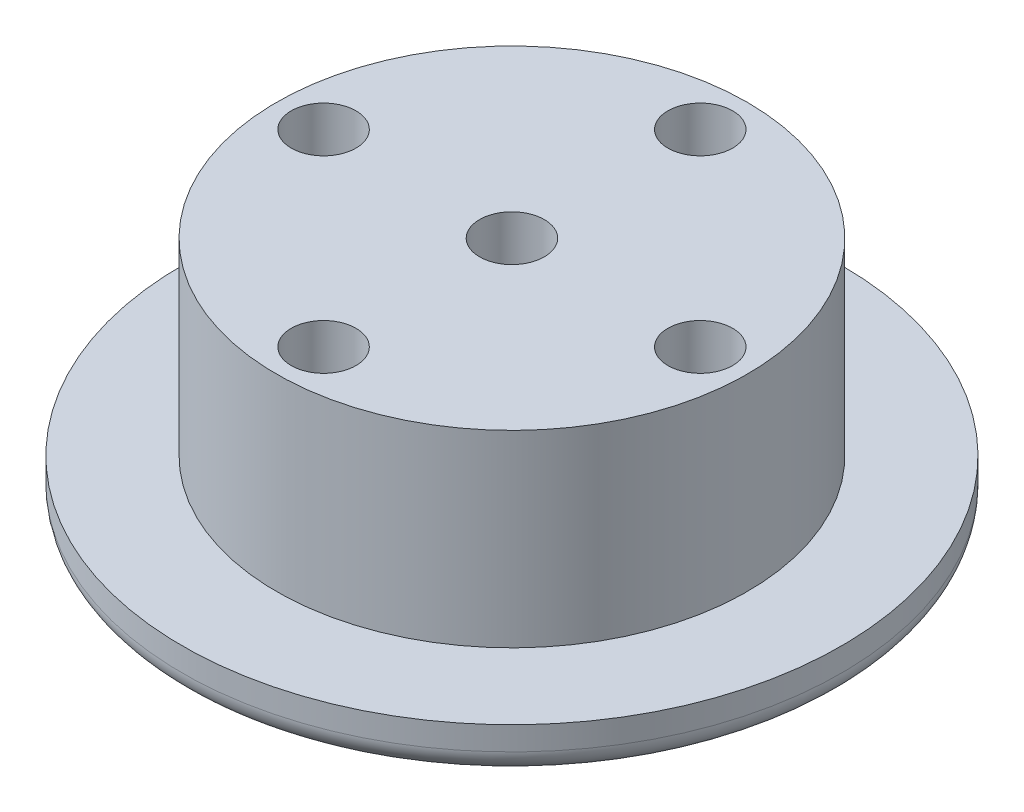
ISO-10303-21;
HEADER;
FILE_DESCRIPTION(('STEP AP214'),'2;1');
FILE_NAME('part.step','',(''),(''),'','','');
FILE_SCHEMA(('AUTOMOTIVE_DESIGN { 1 0 10303 214 1 1 1 1 }'));
ENDSEC;
DATA;
#1=APPLICATION_CONTEXT('core data for automotive mechanical design processes');
#2=APPLICATION_PROTOCOL_DEFINITION('international standard','automotive_design',2000,#1);
#3=PRODUCT_CONTEXT('',#1,'mechanical');
#4=PRODUCT('Part','Part','',(#3));
#5=PRODUCT_RELATED_PRODUCT_CATEGORY('part','',(#4));
#6=PRODUCT_DEFINITION_FORMATION('','',#4);
#7=PRODUCT_DEFINITION_CONTEXT('part definition',#1,'design');
#8=PRODUCT_DEFINITION('design','',#6,#7);
#9=PRODUCT_DEFINITION_SHAPE('','',#8);
#10=(LENGTH_UNIT() NAMED_UNIT(*) SI_UNIT(.MILLI.,.METRE.));
#11=(NAMED_UNIT(*) PLANE_ANGLE_UNIT() SI_UNIT($,.RADIAN.));
#12=(NAMED_UNIT(*) SI_UNIT($,.STERADIAN.) SOLID_ANGLE_UNIT());
#13=UNCERTAINTY_MEASURE_WITH_UNIT(LENGTH_MEASURE(1.E-05),#10,'distance_accuracy_value','');
#14=(GEOMETRIC_REPRESENTATION_CONTEXT(3) GLOBAL_UNCERTAINTY_ASSIGNED_CONTEXT((#13)) GLOBAL_UNIT_ASSIGNED_CONTEXT((#10,
#11,#12)) REPRESENTATION_CONTEXT('',''));
#15=CARTESIAN_POINT('',(0.,0.,0.));
#16=DIRECTION('',(0.,0.,1.));
#17=DIRECTION('',(1.,0.,0.));
#18=AXIS2_PLACEMENT_3D('',#15,#16,#17);
#19=CARTESIAN_POINT('',(20.6375,0.,0.));
#20=DIRECTION('',(0.,-1.,0.));
#21=DIRECTION('',(0.,0.,-1.));
#22=AXIS2_PLACEMENT_3D('',#19,#20,#21);
#23=PLANE('',#22);
#24=CARTESIAN_POINT('',(12.7,0.,0.));
#25=DIRECTION('',(0.,1.,0.));
#26=DIRECTION('',(0.,0.,1.));
#27=AXIS2_PLACEMENT_3D('',#24,#25,#26);
#28=CIRCLE('',#27,2.1828125);
#29=CARTESIAN_POINT('',(12.7,0.,2.1828125));
#30=VERTEX_POINT('',#29);
#31=EDGE_CURVE('E117',#30,#30,#28,.T.);
#32=ORIENTED_EDGE('',*,*,#31,.T.);
#33=EDGE_LOOP('',(#32));
#34=FACE_BOUND('',#33,.T.);
#35=CARTESIAN_POINT('',(-12.7,0.,0.));
#36=DIRECTION('',(0.,1.,0.));
#37=DIRECTION('',(0.,0.,1.));
#38=AXIS2_PLACEMENT_3D('',#35,#36,#37);
#39=CIRCLE('',#38,2.1828125);
#40=CARTESIAN_POINT('',(-12.7,0.,2.1828125));
#41=VERTEX_POINT('',#40);
#42=EDGE_CURVE('E121',#41,#41,#39,.T.);
#43=ORIENTED_EDGE('',*,*,#42,.T.);
#44=EDGE_LOOP('',(#43));
#45=FACE_BOUND('',#44,.T.);
#46=CARTESIAN_POINT('',(0.,0.,12.7));
#47=DIRECTION('',(0.,1.,0.));
#48=DIRECTION('',(0.,0.,1.));
#49=AXIS2_PLACEMENT_3D('',#46,#47,#48);
#50=CIRCLE('',#49,2.1828125);
#51=CARTESIAN_POINT('',(0.,0.,14.8828125));
#52=VERTEX_POINT('',#51);
#53=EDGE_CURVE('E125',#52,#52,#50,.T.);
#54=ORIENTED_EDGE('',*,*,#53,.T.);
#55=EDGE_LOOP('',(#54));
#56=FACE_BOUND('',#55,.T.);
#57=CARTESIAN_POINT('',(0.,0.,-12.7));
#58=DIRECTION('',(0.,1.,0.));
#59=DIRECTION('',(0.,0.,1.));
#60=AXIS2_PLACEMENT_3D('',#57,#58,#59);
#61=CIRCLE('',#60,2.1828125);
#62=CARTESIAN_POINT('',(0.,0.,-10.5171875));
#63=VERTEX_POINT('',#62);
#64=EDGE_CURVE('E129',#63,#63,#61,.T.);
#65=ORIENTED_EDGE('',*,*,#64,.T.);
#66=EDGE_LOOP('',(#65));
#67=FACE_BOUND('',#66,.T.);
#68=CARTESIAN_POINT('',(0.,0.,0.));
#69=DIRECTION('',(0.,1.,0.));
#70=DIRECTION('',(0.,0.,1.));
#71=AXIS2_PLACEMENT_3D('',#68,#69,#70);
#72=CIRCLE('',#71,2.1828125);
#73=CARTESIAN_POINT('',(0.,0.,2.1828125));
#74=VERTEX_POINT('',#73);
#75=EDGE_CURVE('E60',#74,#74,#72,.T.);
#76=ORIENTED_EDGE('',*,*,#75,.T.);
#77=EDGE_LOOP('',(#76));
#78=FACE_BOUND('',#77,.T.);
#79=CARTESIAN_POINT('',(0.,0.,0.));
#80=DIRECTION('',(0.,-1.,0.));
#81=DIRECTION('',(0.,0.,-1.));
#82=AXIS2_PLACEMENT_3D('',#79,#80,#81);
#83=CIRCLE('',#82,20.6375);
#84=CARTESIAN_POINT('',(0.,0.,-20.6375));
#85=VERTEX_POINT('',#84);
#86=EDGE_CURVE('E10',#85,#85,#83,.T.);
#87=ORIENTED_EDGE('',*,*,#86,.T.);
#88=EDGE_LOOP('',(#87));
#89=FACE_BOUND('',#88,.T.);
#90=ADVANCED_FACE('F37',(#34,#45,#56,#67,#78,#89),#23,.T.);
#91=CARTESIAN_POINT('',(0.,1.5875,0.));
#92=DIRECTION('',(0.,-1.,0.));
#93=DIRECTION('',(0.,0.,-1.));
#94=AXIS2_PLACEMENT_3D('',#91,#92,#93);
#95=TOROIDAL_SURFACE('',#94,20.6375,1.5875);
#96=CARTESIAN_POINT('',(0.,1.58750000000001,0.));
#97=DIRECTION('',(0.,-1.,0.));
#98=DIRECTION('',(0.,0.,-1.));
#99=AXIS2_PLACEMENT_3D('',#96,#97,#98);
#100=CIRCLE('',#99,22.225);
#101=CARTESIAN_POINT('',(0.,1.58750000000001,-22.225));
#102=VERTEX_POINT('',#101);
#103=EDGE_CURVE('E45',#102,#102,#100,.T.);
#104=ORIENTED_EDGE('',*,*,#103,.T.);
#105=EDGE_LOOP('',(#104));
#106=FACE_BOUND('',#105,.T.);
#107=ORIENTED_EDGE('',*,*,#86,.F.);
#108=EDGE_LOOP('',(#107));
#109=FACE_BOUND('',#108,.T.);
#110=ADVANCED_FACE('F106',(#106,#109),#95,.T.);
#111=CARTESIAN_POINT('',(0.,0.,0.));
#112=DIRECTION('',(0.,-1.,0.));
#113=DIRECTION('',(0.,0.,-1.));
#114=AXIS2_PLACEMENT_3D('',#111,#112,#113);
#115=CYLINDRICAL_SURFACE('',#114,22.225);
#116=CARTESIAN_POINT('',(0.,3.175,0.));
#117=DIRECTION('',(0.,-1.,0.));
#118=DIRECTION('',(0.,0.,-1.));
#119=AXIS2_PLACEMENT_3D('',#116,#117,#118);
#120=CIRCLE('',#119,22.225);
#121=CARTESIAN_POINT('',(0.,3.175,-22.225));
#122=VERTEX_POINT('',#121);
#123=EDGE_CURVE('E51',#122,#122,#120,.T.);
#124=ORIENTED_EDGE('',*,*,#123,.T.);
#125=EDGE_LOOP('',(#124));
#126=FACE_BOUND('',#125,.T.);
#127=ORIENTED_EDGE('',*,*,#103,.F.);
#128=EDGE_LOOP('',(#127));
#129=FACE_BOUND('',#128,.T.);
#130=ADVANCED_FACE('F92',(#126,#129),#115,.T.);
#131=CARTESIAN_POINT('',(15.875,3.175,0.));
#132=DIRECTION('',(0.,1.,0.));
#133=DIRECTION('',(0.,0.,1.));
#134=AXIS2_PLACEMENT_3D('',#131,#132,#133);
#135=PLANE('',#134);
#136=CARTESIAN_POINT('',(0.,3.175,0.));
#137=DIRECTION('',(0.,-1.,0.));
#138=DIRECTION('',(0.,0.,-1.));
#139=AXIS2_PLACEMENT_3D('',#136,#137,#138);
#140=CIRCLE('',#139,15.875);
#141=CARTESIAN_POINT('',(0.,3.175,-15.875));
#142=VERTEX_POINT('',#141);
#143=EDGE_CURVE('E79',#142,#142,#140,.T.);
#144=ORIENTED_EDGE('',*,*,#143,.T.);
#145=EDGE_LOOP('',(#144));
#146=FACE_BOUND('',#145,.T.);
#147=ORIENTED_EDGE('',*,*,#123,.F.);
#148=EDGE_LOOP('',(#147));
#149=FACE_BOUND('',#148,.T.);
#150=ADVANCED_FACE('F95',(#146,#149),#135,.T.);
#151=CARTESIAN_POINT('',(0.,0.,0.));
#152=DIRECTION('',(0.,-1.,0.));
#153=DIRECTION('',(0.,0.,-1.));
#154=AXIS2_PLACEMENT_3D('',#151,#152,#153);
#155=CYLINDRICAL_SURFACE('',#154,15.875);
#156=CARTESIAN_POINT('',(0.,15.875,0.));
#157=DIRECTION('',(0.,-1.,0.));
#158=DIRECTION('',(0.,0.,-1.));
#159=AXIS2_PLACEMENT_3D('',#156,#157,#158);
#160=CIRCLE('',#159,15.875);
#161=CARTESIAN_POINT('',(0.,15.875,-15.875));
#162=VERTEX_POINT('',#161);
#163=EDGE_CURVE('E74',#162,#162,#160,.T.);
#164=ORIENTED_EDGE('',*,*,#163,.T.);
#165=EDGE_LOOP('',(#164));
#166=FACE_BOUND('',#165,.T.);
#167=ORIENTED_EDGE('',*,*,#143,.F.);
#168=EDGE_LOOP('',(#167));
#169=FACE_BOUND('',#168,.T.);
#170=ADVANCED_FACE('F97',(#166,#169),#155,.T.);
#171=CARTESIAN_POINT('',(0.,15.875,0.));
#172=DIRECTION('',(0.,1.,0.));
#173=DIRECTION('',(0.,0.,1.));
#174=AXIS2_PLACEMENT_3D('',#171,#172,#173);
#175=PLANE('',#174);
#176=CARTESIAN_POINT('',(12.7,15.875,0.));
#177=DIRECTION('',(0.,1.,0.));
#178=DIRECTION('',(0.,0.,1.));
#179=AXIS2_PLACEMENT_3D('',#176,#177,#178);
#180=CIRCLE('',#179,2.1828125);
#181=CARTESIAN_POINT('',(12.7,15.875,2.1828125));
#182=VERTEX_POINT('',#181);
#183=EDGE_CURVE('E40',#182,#182,#180,.T.);
#184=ORIENTED_EDGE('',*,*,#183,.F.);
#185=EDGE_LOOP('',(#184));
#186=FACE_BOUND('',#185,.T.);
#187=CARTESIAN_POINT('',(-12.7,15.875,0.));
#188=DIRECTION('',(0.,1.,0.));
#189=DIRECTION('',(0.,0.,1.));
#190=AXIS2_PLACEMENT_3D('',#187,#188,#189);
#191=CIRCLE('',#190,2.1828125);
#192=CARTESIAN_POINT('',(-12.7,15.875,2.1828125));
#193=VERTEX_POINT('',#192);
#194=EDGE_CURVE('E67',#193,#193,#191,.T.);
#195=ORIENTED_EDGE('',*,*,#194,.F.);
#196=EDGE_LOOP('',(#195));
#197=FACE_BOUND('',#196,.T.);
#198=CARTESIAN_POINT('',(0.,15.875,12.7));
#199=DIRECTION('',(0.,1.,0.));
#200=DIRECTION('',(0.,0.,1.));
#201=AXIS2_PLACEMENT_3D('',#198,#199,#200);
#202=CIRCLE('',#201,2.1828125);
#203=CARTESIAN_POINT('',(0.,15.875,14.8828125));
#204=VERTEX_POINT('',#203);
#205=EDGE_CURVE('E64',#204,#204,#202,.T.);
#206=ORIENTED_EDGE('',*,*,#205,.F.);
#207=EDGE_LOOP('',(#206));
#208=FACE_BOUND('',#207,.T.);
#209=CARTESIAN_POINT('',(0.,15.875,-12.7));
#210=DIRECTION('',(0.,1.,0.));
#211=DIRECTION('',(0.,0.,1.));
#212=AXIS2_PLACEMENT_3D('',#209,#210,#211);
#213=CIRCLE('',#212,2.1828125);
#214=CARTESIAN_POINT('',(0.,15.875,-10.5171875));
#215=VERTEX_POINT('',#214);
#216=EDGE_CURVE('E59',#215,#215,#213,.T.);
#217=ORIENTED_EDGE('',*,*,#216,.F.);
#218=EDGE_LOOP('',(#217));
#219=FACE_BOUND('',#218,.T.);
#220=CARTESIAN_POINT('',(0.,15.875,0.));
#221=DIRECTION('',(0.,1.,0.));
#222=DIRECTION('',(0.,0.,1.));
#223=AXIS2_PLACEMENT_3D('',#220,#221,#222);
#224=CIRCLE('',#223,2.1828125);
#225=CARTESIAN_POINT('',(0.,15.875,2.1828125));
#226=VERTEX_POINT('',#225);
#227=EDGE_CURVE('E55',#226,#226,#224,.T.);
#228=ORIENTED_EDGE('',*,*,#227,.F.);
#229=EDGE_LOOP('',(#228));
#230=FACE_BOUND('',#229,.T.);
#231=ORIENTED_EDGE('',*,*,#163,.F.);
#232=EDGE_LOOP('',(#231));
#233=FACE_BOUND('',#232,.T.);
#234=ADVANCED_FACE('F104',(#186,#197,#208,#219,#230,#233),#175,.T.);
#235=CARTESIAN_POINT('',(0.,0.,0.));
#236=DIRECTION('',(0.,1.,0.));
#237=DIRECTION('',(0.,0.,1.));
#238=AXIS2_PLACEMENT_3D('',#235,#236,#237);
#239=CYLINDRICAL_SURFACE('',#238,2.1828125);
#240=ORIENTED_EDGE('',*,*,#227,.T.);
#241=EDGE_LOOP('',(#240));
#242=FACE_BOUND('',#241,.T.);
#243=ORIENTED_EDGE('',*,*,#75,.F.);
#244=EDGE_LOOP('',(#243));
#245=FACE_BOUND('',#244,.T.);
#246=ADVANCED_FACE('F141',(#242,#245),#239,.F.);
#247=CARTESIAN_POINT('',(0.,0.,-12.7));
#248=DIRECTION('',(0.,1.,0.));
#249=DIRECTION('',(0.,0.,1.));
#250=AXIS2_PLACEMENT_3D('',#247,#248,#249);
#251=CYLINDRICAL_SURFACE('',#250,2.1828125);
#252=ORIENTED_EDGE('',*,*,#216,.T.);
#253=EDGE_LOOP('',(#252));
#254=FACE_BOUND('',#253,.T.);
#255=ORIENTED_EDGE('',*,*,#64,.F.);
#256=EDGE_LOOP('',(#255));
#257=FACE_BOUND('',#256,.T.);
#258=ADVANCED_FACE('F143',(#254,#257),#251,.F.);
#259=CARTESIAN_POINT('',(0.,0.,12.7));
#260=DIRECTION('',(0.,1.,0.));
#261=DIRECTION('',(0.,0.,1.));
#262=AXIS2_PLACEMENT_3D('',#259,#260,#261);
#263=CYLINDRICAL_SURFACE('',#262,2.1828125);
#264=ORIENTED_EDGE('',*,*,#205,.T.);
#265=EDGE_LOOP('',(#264));
#266=FACE_BOUND('',#265,.T.);
#267=ORIENTED_EDGE('',*,*,#53,.F.);
#268=EDGE_LOOP('',(#267));
#269=FACE_BOUND('',#268,.T.);
#270=ADVANCED_FACE('F150',(#266,#269),#263,.F.);
#271=CARTESIAN_POINT('',(-12.7,0.,0.));
#272=DIRECTION('',(0.,1.,0.));
#273=DIRECTION('',(0.,0.,1.));
#274=AXIS2_PLACEMENT_3D('',#271,#272,#273);
#275=CYLINDRICAL_SURFACE('',#274,2.1828125);
#276=ORIENTED_EDGE('',*,*,#194,.T.);
#277=EDGE_LOOP('',(#276));
#278=FACE_BOUND('',#277,.T.);
#279=ORIENTED_EDGE('',*,*,#42,.F.);
#280=EDGE_LOOP('',(#279));
#281=FACE_BOUND('',#280,.T.);
#282=ADVANCED_FACE('F156',(#278,#281),#275,.F.);
#283=CARTESIAN_POINT('',(12.7,0.,0.));
#284=DIRECTION('',(0.,1.,0.));
#285=DIRECTION('',(0.,0.,1.));
#286=AXIS2_PLACEMENT_3D('',#283,#284,#285);
#287=CYLINDRICAL_SURFACE('',#286,2.1828125);
#288=ORIENTED_EDGE('',*,*,#183,.T.);
#289=EDGE_LOOP('',(#288));
#290=FACE_BOUND('',#289,.T.);
#291=ORIENTED_EDGE('',*,*,#31,.F.);
#292=EDGE_LOOP('',(#291));
#293=FACE_BOUND('',#292,.T.);
#294=ADVANCED_FACE('F159',(#290,#293),#287,.F.);
#295=CLOSED_SHELL('',(#90,#110,#130,#150,#170,#234,#246,#258,#270,#282,#294));
#296=MANIFOLD_SOLID_BREP('B2',#295);
#297=ADVANCED_BREP_SHAPE_REPRESENTATION('',(#18,#296),#14);
#298=SHAPE_DEFINITION_REPRESENTATION(#9,#297);
ENDSEC;
END-ISO-10303-21;
